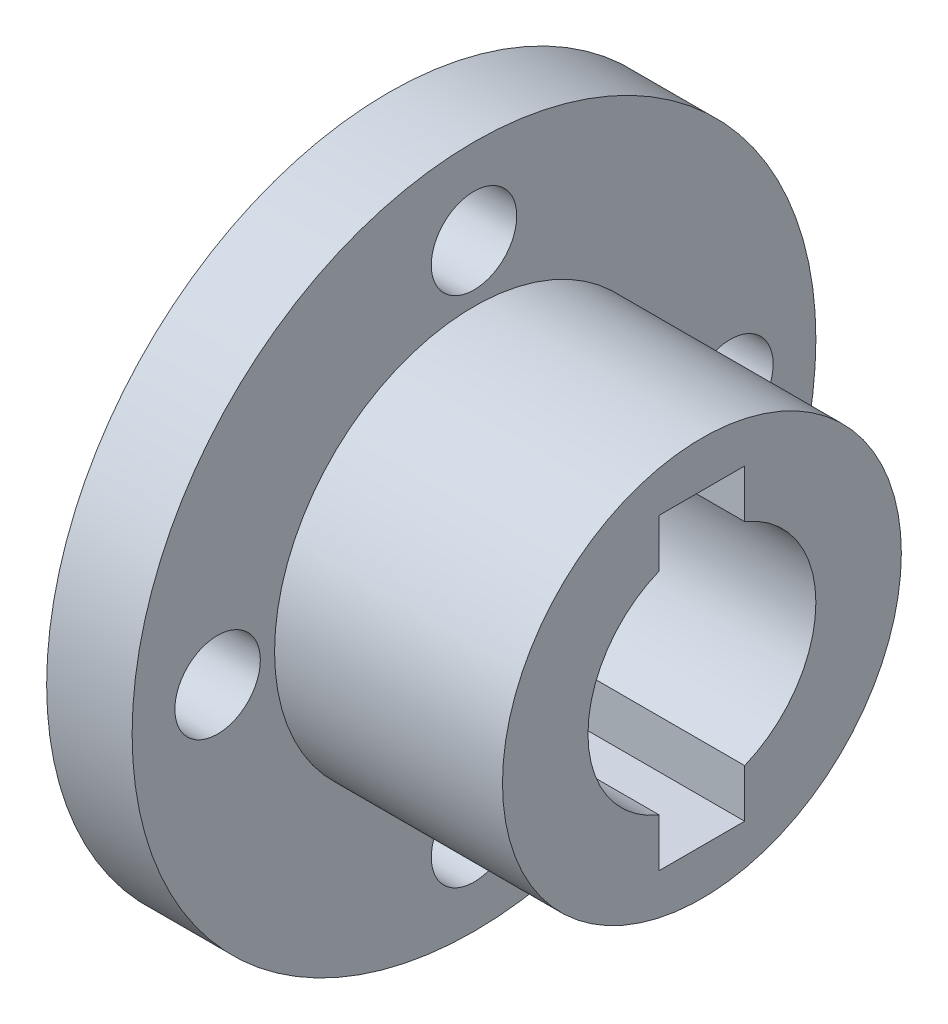
ISO-10303-21;
HEADER;
FILE_DESCRIPTION(('STEP AP214'),'2;1');
FILE_NAME('part.step','',(''),(''),'','','');
FILE_SCHEMA(('AUTOMOTIVE_DESIGN { 1 0 10303 214 1 1 1 1 }'));
ENDSEC;
DATA;
#1=APPLICATION_CONTEXT('core data for automotive mechanical design processes');
#2=APPLICATION_PROTOCOL_DEFINITION('international standard','automotive_design',2000,#1);
#3=PRODUCT_CONTEXT('',#1,'mechanical');
#4=PRODUCT('Part','Part','',(#3));
#5=PRODUCT_RELATED_PRODUCT_CATEGORY('part','',(#4));
#6=PRODUCT_DEFINITION_FORMATION('','',#4);
#7=PRODUCT_DEFINITION_CONTEXT('part definition',#1,'design');
#8=PRODUCT_DEFINITION('design','',#6,#7);
#9=PRODUCT_DEFINITION_SHAPE('','',#8);
#10=(LENGTH_UNIT() NAMED_UNIT(*) SI_UNIT(.MILLI.,.METRE.));
#11=(NAMED_UNIT(*) PLANE_ANGLE_UNIT() SI_UNIT($,.RADIAN.));
#12=(NAMED_UNIT(*) SI_UNIT($,.STERADIAN.) SOLID_ANGLE_UNIT());
#13=UNCERTAINTY_MEASURE_WITH_UNIT(LENGTH_MEASURE(1.E-05),#10,'distance_accuracy_value','');
#14=(GEOMETRIC_REPRESENTATION_CONTEXT(3) GLOBAL_UNCERTAINTY_ASSIGNED_CONTEXT((#13)) GLOBAL_UNIT_ASSIGNED_CONTEXT((#10,
#11,#12)) REPRESENTATION_CONTEXT('',''));
#15=CARTESIAN_POINT('',(0.,0.,0.));
#16=DIRECTION('',(0.,0.,1.));
#17=DIRECTION('',(1.,0.,0.));
#18=AXIS2_PLACEMENT_3D('',#15,#16,#17);
#19=CARTESIAN_POINT('',(0.,0.,0.));
#20=DIRECTION('',(-1.,0.,0.));
#21=DIRECTION('',(0.,0.,1.));
#22=AXIS2_PLACEMENT_3D('',#19,#20,#21);
#23=PLANE('',#22);
#24=CARTESIAN_POINT('',(0.,0.,0.));
#25=DIRECTION('',(1.,0.,0.));
#26=DIRECTION('',(0.,0.,-1.));
#27=AXIS2_PLACEMENT_3D('',#24,#25,#26);
#28=CIRCLE('',#27,4.);
#29=CARTESIAN_POINT('',(0.,-3.70809924354783,-1.5));
#30=VERTEX_POINT('',#29);
#31=CARTESIAN_POINT('',(0.,3.70809924354783,-1.5));
#32=VERTEX_POINT('',#31);
#33=EDGE_CURVE('E52',#30,#32,#28,.T.);
#34=ORIENTED_EDGE('',*,*,#33,.T.);
#35=DIRECTION('',(0.,1.,0.));
#36=VECTOR('',#35,1.);
#37=CARTESIAN_POINT('',(0.,5.4,-1.5));
#38=LINE('',#37,#36);
#39=CARTESIAN_POINT('',(0.,5.4,-1.5));
#40=VERTEX_POINT('',#39);
#41=EDGE_CURVE('E102',#32,#40,#38,.T.);
#42=ORIENTED_EDGE('',*,*,#41,.T.);
#43=DIRECTION('',(0.,0.,1.));
#44=VECTOR('',#43,1.);
#45=CARTESIAN_POINT('',(0.,5.4,1.5));
#46=LINE('',#45,#44);
#47=CARTESIAN_POINT('',(0.,5.4,1.5));
#48=VERTEX_POINT('',#47);
#49=EDGE_CURVE('E112',#40,#48,#46,.T.);
#50=ORIENTED_EDGE('',*,*,#49,.T.);
#51=DIRECTION('',(0.,-1.,0.));
#52=VECTOR('',#51,1.);
#53=CARTESIAN_POINT('',(0.,5.4,1.5));
#54=LINE('',#53,#52);
#55=CARTESIAN_POINT('',(0.,3.70809924354783,1.5));
#56=VERTEX_POINT('',#55);
#57=EDGE_CURVE('E121',#48,#56,#54,.T.);
#58=ORIENTED_EDGE('',*,*,#57,.T.);
#59=CARTESIAN_POINT('',(0.,-3.70809924354783,1.5));
#60=VERTEX_POINT('',#59);
#61=EDGE_CURVE('E363',#56,#60,#28,.T.);
#62=ORIENTED_EDGE('',*,*,#61,.T.);
#63=DIRECTION('',(0.,-1.,0.));
#64=VECTOR('',#63,1.);
#65=CARTESIAN_POINT('',(0.,-5.4,1.5));
#66=LINE('',#65,#64);
#67=CARTESIAN_POINT('',(0.,-5.4,1.5));
#68=VERTEX_POINT('',#67);
#69=EDGE_CURVE('E376',#60,#68,#66,.T.);
#70=ORIENTED_EDGE('',*,*,#69,.T.);
#71=DIRECTION('',(0.,0.,-1.));
#72=VECTOR('',#71,1.);
#73=CARTESIAN_POINT('',(0.,-5.4,1.5));
#74=LINE('',#73,#72);
#75=CARTESIAN_POINT('',(0.,-5.4,-1.5));
#76=VERTEX_POINT('',#75);
#77=EDGE_CURVE('E353',#68,#76,#74,.T.);
#78=ORIENTED_EDGE('',*,*,#77,.T.);
#79=DIRECTION('',(0.,1.,0.));
#80=VECTOR('',#79,1.);
#81=CARTESIAN_POINT('',(0.,-5.4,-1.5));
#82=LINE('',#81,#80);
#83=EDGE_CURVE('E384',#76,#30,#82,.T.);
#84=ORIENTED_EDGE('',*,*,#83,.T.);
#85=EDGE_LOOP('',(#34,#42,#50,#58,#62,#70,#78,#84));
#86=FACE_BOUND('',#85,.T.);
#87=CARTESIAN_POINT('',(0.,9.,0.));
#88=DIRECTION('',(-1.,0.,0.));
#89=DIRECTION('',(0.,0.,1.));
#90=AXIS2_PLACEMENT_3D('',#87,#88,#89);
#91=CIRCLE('',#90,1.5);
#92=CARTESIAN_POINT('',(0.,9.,1.5));
#93=VERTEX_POINT('',#92);
#94=EDGE_CURVE('E406',#93,#93,#91,.F.);
#95=ORIENTED_EDGE('',*,*,#94,.T.);
#96=EDGE_LOOP('',(#95));
#97=FACE_BOUND('',#96,.T.);
#98=CARTESIAN_POINT('',(0.,0.,-9.));
#99=DIRECTION('',(-1.,0.,0.));
#100=DIRECTION('',(0.,0.,1.));
#101=AXIS2_PLACEMENT_3D('',#98,#99,#100);
#102=CIRCLE('',#101,1.5);
#103=CARTESIAN_POINT('',(0.,0.,-7.5));
#104=VERTEX_POINT('',#103);
#105=EDGE_CURVE('E403',#104,#104,#102,.F.);
#106=ORIENTED_EDGE('',*,*,#105,.T.);
#107=EDGE_LOOP('',(#106));
#108=FACE_BOUND('',#107,.T.);
#109=CARTESIAN_POINT('',(0.,-9.,0.));
#110=DIRECTION('',(-1.,0.,0.));
#111=DIRECTION('',(0.,0.,1.));
#112=AXIS2_PLACEMENT_3D('',#109,#110,#111);
#113=CIRCLE('',#112,1.5);
#114=CARTESIAN_POINT('',(0.,-9.,1.50000000000006));
#115=VERTEX_POINT('',#114);
#116=EDGE_CURVE('E397',#115,#115,#113,.F.);
#117=ORIENTED_EDGE('',*,*,#116,.T.);
#118=EDGE_LOOP('',(#117));
#119=FACE_BOUND('',#118,.T.);
#120=CARTESIAN_POINT('',(0.,0.,9.));
#121=DIRECTION('',(-1.,0.,0.));
#122=DIRECTION('',(0.,0.,1.));
#123=AXIS2_PLACEMENT_3D('',#120,#121,#122);
#124=CIRCLE('',#123,1.5);
#125=CARTESIAN_POINT('',(0.,0.,10.5));
#126=VERTEX_POINT('',#125);
#127=EDGE_CURVE('E391',#126,#126,#124,.F.);
#128=ORIENTED_EDGE('',*,*,#127,.T.);
#129=EDGE_LOOP('',(#128));
#130=FACE_BOUND('',#129,.T.);
#131=CARTESIAN_POINT('',(0.,0.,0.));
#132=DIRECTION('',(1.,0.,0.));
#133=DIRECTION('',(0.,0.,-1.));
#134=AXIS2_PLACEMENT_3D('',#131,#132,#133);
#135=CIRCLE('',#134,12.);
#136=CARTESIAN_POINT('',(0.,0.,-12.));
#137=VERTEX_POINT('',#136);
#138=EDGE_CURVE('E11',#137,#137,#135,.T.);
#139=ORIENTED_EDGE('',*,*,#138,.F.);
#140=EDGE_LOOP('',(#139));
#141=FACE_BOUND('',#140,.T.);
#142=ADVANCED_FACE('F38',(#86,#97,#108,#119,#130,#141),#23,.T.);
#143=CARTESIAN_POINT('',(3.,0.,0.));
#144=DIRECTION('',(1.,0.,0.));
#145=DIRECTION('',(0.,0.,-1.));
#146=AXIS2_PLACEMENT_3D('',#143,#144,#145);
#147=CYLINDRICAL_SURFACE('',#146,4.);
#148=DIRECTION('',(1.,0.,0.));
#149=VECTOR('',#148,1.);
#150=CARTESIAN_POINT('',(0.,-3.70809924354783,1.5));
#151=LINE('',#150,#149);
#152=CARTESIAN_POINT('',(11.,-3.70809924354783,1.5));
#153=VERTEX_POINT('',#152);
#154=EDGE_CURVE('E358',#60,#153,#151,.T.);
#155=ORIENTED_EDGE('',*,*,#154,.F.);
#156=ORIENTED_EDGE('',*,*,#61,.F.);
#157=DIRECTION('',(1.,0.,0.));
#158=VECTOR('',#157,1.);
#159=CARTESIAN_POINT('',(0.,3.70809924354783,1.5));
#160=LINE('',#159,#158);
#161=CARTESIAN_POINT('',(11.,3.70809924354783,1.5));
#162=VERTEX_POINT('',#161);
#163=EDGE_CURVE('E117',#56,#162,#160,.T.);
#164=ORIENTED_EDGE('',*,*,#163,.T.);
#165=CARTESIAN_POINT('',(11.,0.,0.));
#166=DIRECTION('',(1.,0.,0.));
#167=DIRECTION('',(0.,0.,-1.));
#168=AXIS2_PLACEMENT_3D('',#165,#166,#167);
#169=CIRCLE('',#168,4.);
#170=EDGE_CURVE('E130',#162,#153,#169,.T.);
#171=ORIENTED_EDGE('',*,*,#170,.T.);
#172=EDGE_LOOP('',(#155,#156,#164,#171));
#173=FACE_BOUND('',#172,.T.);
#174=ADVANCED_FACE('F144',(#173),#147,.F.);
#175=CARTESIAN_POINT('',(3.,0.,0.));
#176=DIRECTION('',(1.,0.,0.));
#177=DIRECTION('',(0.,0.,-1.));
#178=AXIS2_PLACEMENT_3D('',#175,#176,#177);
#179=CYLINDRICAL_SURFACE('',#178,12.);
#180=ORIENTED_EDGE('',*,*,#138,.T.);
#181=EDGE_LOOP('',(#180));
#182=FACE_BOUND('',#181,.T.);
#183=CARTESIAN_POINT('',(3.,0.,0.));
#184=DIRECTION('',(1.,0.,0.));
#185=DIRECTION('',(0.,0.,-1.));
#186=AXIS2_PLACEMENT_3D('',#183,#184,#185);
#187=CIRCLE('',#186,12.);
#188=CARTESIAN_POINT('',(3.,0.,-12.));
#189=VERTEX_POINT('',#188);
#190=EDGE_CURVE('E45',#189,#189,#187,.T.);
#191=ORIENTED_EDGE('',*,*,#190,.F.);
#192=EDGE_LOOP('',(#191));
#193=FACE_BOUND('',#192,.T.);
#194=ADVANCED_FACE('F142',(#182,#193),#179,.T.);
#195=CARTESIAN_POINT('',(3.,0.,-12.));
#196=DIRECTION('',(1.,0.,0.));
#197=DIRECTION('',(0.,0.,-1.));
#198=AXIS2_PLACEMENT_3D('',#195,#196,#197);
#199=PLANE('',#198);
#200=CARTESIAN_POINT('',(3.,9.,0.));
#201=DIRECTION('',(1.,0.,0.));
#202=DIRECTION('',(0.,0.,-1.));
#203=AXIS2_PLACEMENT_3D('',#200,#201,#202);
#204=CIRCLE('',#203,1.5);
#205=CARTESIAN_POINT('',(3.,9.,-1.5));
#206=VERTEX_POINT('',#205);
#207=EDGE_CURVE('E370',#206,#206,#204,.T.);
#208=ORIENTED_EDGE('',*,*,#207,.F.);
#209=EDGE_LOOP('',(#208));
#210=FACE_BOUND('',#209,.T.);
#211=CARTESIAN_POINT('',(3.,0.,-9.));
#212=DIRECTION('',(1.,0.,0.));
#213=DIRECTION('',(0.,0.,-1.));
#214=AXIS2_PLACEMENT_3D('',#211,#212,#213);
#215=CIRCLE('',#214,1.5);
#216=CARTESIAN_POINT('',(3.,0.,-10.5));
#217=VERTEX_POINT('',#216);
#218=EDGE_CURVE('E400',#217,#217,#215,.T.);
#219=ORIENTED_EDGE('',*,*,#218,.F.);
#220=EDGE_LOOP('',(#219));
#221=FACE_BOUND('',#220,.T.);
#222=CARTESIAN_POINT('',(3.,-9.,0.));
#223=DIRECTION('',(1.,0.,0.));
#224=DIRECTION('',(0.,0.,-1.));
#225=AXIS2_PLACEMENT_3D('',#222,#223,#224);
#226=CIRCLE('',#225,1.5);
#227=CARTESIAN_POINT('',(3.,-9.,-1.49999999999994));
#228=VERTEX_POINT('',#227);
#229=EDGE_CURVE('E394',#228,#228,#226,.T.);
#230=ORIENTED_EDGE('',*,*,#229,.F.);
#231=EDGE_LOOP('',(#230));
#232=FACE_BOUND('',#231,.T.);
#233=CARTESIAN_POINT('',(3.,0.,9.));
#234=DIRECTION('',(1.,0.,0.));
#235=DIRECTION('',(0.,0.,-1.));
#236=AXIS2_PLACEMENT_3D('',#233,#234,#235);
#237=CIRCLE('',#236,1.5);
#238=CARTESIAN_POINT('',(3.,0.,7.5));
#239=VERTEX_POINT('',#238);
#240=EDGE_CURVE('E388',#239,#239,#237,.T.);
#241=ORIENTED_EDGE('',*,*,#240,.F.);
#242=EDGE_LOOP('',(#241));
#243=FACE_BOUND('',#242,.T.);
#244=ORIENTED_EDGE('',*,*,#190,.T.);
#245=EDGE_LOOP('',(#244));
#246=FACE_BOUND('',#245,.T.);
#247=CARTESIAN_POINT('',(3.,0.,0.));
#248=DIRECTION('',(1.,0.,0.));
#249=DIRECTION('',(0.,0.,-1.));
#250=AXIS2_PLACEMENT_3D('',#247,#248,#249);
#251=CIRCLE('',#250,7.);
#252=CARTESIAN_POINT('',(3.,0.,-7.));
#253=VERTEX_POINT('',#252);
#254=EDGE_CURVE('E134',#253,#253,#251,.T.);
#255=ORIENTED_EDGE('',*,*,#254,.F.);
#256=EDGE_LOOP('',(#255));
#257=FACE_BOUND('',#256,.T.);
#258=ADVANCED_FACE('F139',(#210,#221,#232,#243,#246,#257),#199,.T.);
#259=CARTESIAN_POINT('',(3.,0.,0.));
#260=DIRECTION('',(1.,0.,0.));
#261=DIRECTION('',(0.,0.,-1.));
#262=AXIS2_PLACEMENT_3D('',#259,#260,#261);
#263=CYLINDRICAL_SURFACE('',#262,7.);
#264=ORIENTED_EDGE('',*,*,#254,.T.);
#265=EDGE_LOOP('',(#264));
#266=FACE_BOUND('',#265,.T.);
#267=CARTESIAN_POINT('',(11.,0.,0.));
#268=DIRECTION('',(1.,0.,0.));
#269=DIRECTION('',(0.,0.,-1.));
#270=AXIS2_PLACEMENT_3D('',#267,#268,#269);
#271=CIRCLE('',#270,7.);
#272=CARTESIAN_POINT('',(11.,0.,-7.));
#273=VERTEX_POINT('',#272);
#274=EDGE_CURVE('E131',#273,#273,#271,.T.);
#275=ORIENTED_EDGE('',*,*,#274,.F.);
#276=EDGE_LOOP('',(#275));
#277=FACE_BOUND('',#276,.T.);
#278=ADVANCED_FACE('F150',(#266,#277),#263,.T.);
#279=CARTESIAN_POINT('',(11.,0.,-7.));
#280=DIRECTION('',(1.,0.,0.));
#281=DIRECTION('',(0.,0.,-1.));
#282=AXIS2_PLACEMENT_3D('',#279,#280,#281);
#283=PLANE('',#282);
#284=DIRECTION('',(0.,-1.,0.));
#285=VECTOR('',#284,1.);
#286=CARTESIAN_POINT('',(11.,-5.4,1.5));
#287=LINE('',#286,#285);
#288=CARTESIAN_POINT('',(11.,-5.4,1.5));
#289=VERTEX_POINT('',#288);
#290=EDGE_CURVE('E347',#153,#289,#287,.T.);
#291=ORIENTED_EDGE('',*,*,#290,.F.);
#292=ORIENTED_EDGE('',*,*,#170,.F.);
#293=DIRECTION('',(0.,-1.,0.));
#294=VECTOR('',#293,1.);
#295=CARTESIAN_POINT('',(11.,5.4,1.5));
#296=LINE('',#295,#294);
#297=CARTESIAN_POINT('',(11.,5.4,1.5));
#298=VERTEX_POINT('',#297);
#299=EDGE_CURVE('E365',#298,#162,#296,.T.);
#300=ORIENTED_EDGE('',*,*,#299,.F.);
#301=DIRECTION('',(0.,0.,1.));
#302=VECTOR('',#301,1.);
#303=CARTESIAN_POINT('',(11.,5.4,1.5));
#304=LINE('',#303,#302);
#305=CARTESIAN_POINT('',(11.,5.4,-1.5));
#306=VERTEX_POINT('',#305);
#307=EDGE_CURVE('E123',#306,#298,#304,.T.);
#308=ORIENTED_EDGE('',*,*,#307,.F.);
#309=DIRECTION('',(0.,1.,0.));
#310=VECTOR('',#309,1.);
#311=CARTESIAN_POINT('',(11.,5.4,-1.5));
#312=LINE('',#311,#310);
#313=CARTESIAN_POINT('',(11.,3.70809924354783,-1.5));
#314=VERTEX_POINT('',#313);
#315=EDGE_CURVE('E104',#314,#306,#312,.T.);
#316=ORIENTED_EDGE('',*,*,#315,.F.);
#317=CARTESIAN_POINT('',(11.,-3.70809924354783,-1.5));
#318=VERTEX_POINT('',#317);
#319=EDGE_CURVE('E127',#318,#314,#169,.T.);
#320=ORIENTED_EDGE('',*,*,#319,.F.);
#321=DIRECTION('',(0.,1.,0.));
#322=VECTOR('',#321,1.);
#323=CARTESIAN_POINT('',(11.,-5.4,-1.5));
#324=LINE('',#323,#322);
#325=CARTESIAN_POINT('',(11.,-5.4,-1.5));
#326=VERTEX_POINT('',#325);
#327=EDGE_CURVE('E354',#326,#318,#324,.T.);
#328=ORIENTED_EDGE('',*,*,#327,.F.);
#329=DIRECTION('',(0.,0.,-1.));
#330=VECTOR('',#329,1.);
#331=CARTESIAN_POINT('',(11.,-5.4,1.5));
#332=LINE('',#331,#330);
#333=EDGE_CURVE('E352',#289,#326,#332,.T.);
#334=ORIENTED_EDGE('',*,*,#333,.F.);
#335=EDGE_LOOP('',(#291,#292,#300,#308,#316,#320,#328,#334));
#336=FACE_BOUND('',#335,.T.);
#337=ORIENTED_EDGE('',*,*,#274,.T.);
#338=EDGE_LOOP('',(#337));
#339=FACE_BOUND('',#338,.T.);
#340=ADVANCED_FACE('F176',(#336,#339),#283,.T.);
#341=DIRECTION('',(1.,0.,0.));
#342=VECTOR('',#341,1.);
#343=CARTESIAN_POINT('',(0.,-3.70809924354783,-1.5));
#344=LINE('',#343,#342);
#345=EDGE_CURVE('E375',#30,#318,#344,.T.);
#346=ORIENTED_EDGE('',*,*,#345,.T.);
#347=ORIENTED_EDGE('',*,*,#319,.T.);
#348=DIRECTION('',(1.,0.,0.));
#349=VECTOR('',#348,1.);
#350=CARTESIAN_POINT('',(0.,3.70809924354783,-1.5));
#351=LINE('',#350,#349);
#352=EDGE_CURVE('E108',#32,#314,#351,.T.);
#353=ORIENTED_EDGE('',*,*,#352,.F.);
#354=ORIENTED_EDGE('',*,*,#33,.F.);
#355=EDGE_LOOP('',(#346,#347,#353,#354));
#356=FACE_BOUND('',#355,.T.);
#357=ADVANCED_FACE('F155',(#356),#147,.F.);
#358=CARTESIAN_POINT('',(0.,5.4,1.5));
#359=DIRECTION('',(0.,0.,1.));
#360=DIRECTION('',(1.,0.,0.));
#361=AXIS2_PLACEMENT_3D('',#358,#359,#360);
#362=PLANE('',#361);
#363=ORIENTED_EDGE('',*,*,#299,.T.);
#364=ORIENTED_EDGE('',*,*,#163,.F.);
#365=ORIENTED_EDGE('',*,*,#57,.F.);
#366=DIRECTION('',(1.,0.,0.));
#367=VECTOR('',#366,1.);
#368=CARTESIAN_POINT('',(0.,5.4,1.5));
#369=LINE('',#368,#367);
#370=EDGE_CURVE('E109',#48,#298,#369,.T.);
#371=ORIENTED_EDGE('',*,*,#370,.T.);
#372=EDGE_LOOP('',(#363,#364,#365,#371));
#373=FACE_BOUND('',#372,.T.);
#374=ADVANCED_FACE('F175',(#373),#362,.F.);
#375=CARTESIAN_POINT('',(0.,5.4,1.5));
#376=DIRECTION('',(0.,1.,0.));
#377=DIRECTION('',(0.,0.,1.));
#378=AXIS2_PLACEMENT_3D('',#375,#376,#377);
#379=PLANE('',#378);
#380=ORIENTED_EDGE('',*,*,#307,.T.);
#381=ORIENTED_EDGE('',*,*,#370,.F.);
#382=ORIENTED_EDGE('',*,*,#49,.F.);
#383=DIRECTION('',(1.,0.,0.));
#384=VECTOR('',#383,1.);
#385=CARTESIAN_POINT('',(0.,5.4,-1.5));
#386=LINE('',#385,#384);
#387=EDGE_CURVE('E97',#40,#306,#386,.T.);
#388=ORIENTED_EDGE('',*,*,#387,.T.);
#389=EDGE_LOOP('',(#380,#381,#382,#388));
#390=FACE_BOUND('',#389,.T.);
#391=ADVANCED_FACE('F113',(#390),#379,.F.);
#392=CARTESIAN_POINT('',(0.,5.4,-1.5));
#393=DIRECTION('',(0.,0.,-1.));
#394=DIRECTION('',(-1.,0.,0.));
#395=AXIS2_PLACEMENT_3D('',#392,#393,#394);
#396=PLANE('',#395);
#397=ORIENTED_EDGE('',*,*,#315,.T.);
#398=ORIENTED_EDGE('',*,*,#387,.F.);
#399=ORIENTED_EDGE('',*,*,#41,.F.);
#400=ORIENTED_EDGE('',*,*,#352,.T.);
#401=EDGE_LOOP('',(#397,#398,#399,#400));
#402=FACE_BOUND('',#401,.T.);
#403=ADVANCED_FACE('F99',(#402),#396,.F.);
#404=CARTESIAN_POINT('',(0.,-5.4,1.5));
#405=DIRECTION('',(0.,-1.,0.));
#406=DIRECTION('',(0.,0.,-1.));
#407=AXIS2_PLACEMENT_3D('',#404,#405,#406);
#408=PLANE('',#407);
#409=ORIENTED_EDGE('',*,*,#333,.T.);
#410=DIRECTION('',(1.,0.,0.));
#411=VECTOR('',#410,1.);
#412=CARTESIAN_POINT('',(0.,-5.4,-1.5));
#413=LINE('',#412,#411);
#414=EDGE_CURVE('E373',#76,#326,#413,.T.);
#415=ORIENTED_EDGE('',*,*,#414,.F.);
#416=ORIENTED_EDGE('',*,*,#77,.F.);
#417=DIRECTION('',(1.,0.,0.));
#418=VECTOR('',#417,1.);
#419=CARTESIAN_POINT('',(0.,-5.4,1.5));
#420=LINE('',#419,#418);
#421=EDGE_CURVE('E61',#68,#289,#420,.T.);
#422=ORIENTED_EDGE('',*,*,#421,.T.);
#423=EDGE_LOOP('',(#409,#415,#416,#422));
#424=FACE_BOUND('',#423,.T.);
#425=ADVANCED_FACE('F198',(#424),#408,.F.);
#426=CARTESIAN_POINT('',(0.,-5.4,1.5));
#427=DIRECTION('',(0.,0.,1.));
#428=DIRECTION('',(1.,0.,0.));
#429=AXIS2_PLACEMENT_3D('',#426,#427,#428);
#430=PLANE('',#429);
#431=ORIENTED_EDGE('',*,*,#290,.T.);
#432=ORIENTED_EDGE('',*,*,#421,.F.);
#433=ORIENTED_EDGE('',*,*,#69,.F.);
#434=ORIENTED_EDGE('',*,*,#154,.T.);
#435=EDGE_LOOP('',(#431,#432,#433,#434));
#436=FACE_BOUND('',#435,.T.);
#437=ADVANCED_FACE('F206',(#436),#430,.F.);
#438=CARTESIAN_POINT('',(0.,-5.4,-1.5));
#439=DIRECTION('',(0.,0.,-1.));
#440=DIRECTION('',(-1.,0.,0.));
#441=AXIS2_PLACEMENT_3D('',#438,#439,#440);
#442=PLANE('',#441);
#443=ORIENTED_EDGE('',*,*,#327,.T.);
#444=ORIENTED_EDGE('',*,*,#345,.F.);
#445=ORIENTED_EDGE('',*,*,#83,.F.);
#446=ORIENTED_EDGE('',*,*,#414,.T.);
#447=EDGE_LOOP('',(#443,#444,#445,#446));
#448=FACE_BOUND('',#447,.T.);
#449=ADVANCED_FACE('F211',(#448),#442,.F.);
#450=CARTESIAN_POINT('',(-0.00100000000000013,0.,9.));
#451=DIRECTION('',(1.,0.,0.));
#452=DIRECTION('',(0.,0.,-1.));
#453=AXIS2_PLACEMENT_3D('',#450,#451,#452);
#454=CYLINDRICAL_SURFACE('',#453,1.5);
#455=ORIENTED_EDGE('',*,*,#127,.F.);
#456=EDGE_LOOP('',(#455));
#457=FACE_BOUND('',#456,.T.);
#458=ORIENTED_EDGE('',*,*,#240,.T.);
#459=EDGE_LOOP('',(#458));
#460=FACE_BOUND('',#459,.T.);
#461=ADVANCED_FACE('F220',(#457,#460),#454,.F.);
#462=CARTESIAN_POINT('',(-0.00100000000000013,-9.,0.));
#463=DIRECTION('',(1.,0.,0.));
#464=DIRECTION('',(0.,0.,-1.));
#465=AXIS2_PLACEMENT_3D('',#462,#463,#464);
#466=CYLINDRICAL_SURFACE('',#465,1.5);
#467=ORIENTED_EDGE('',*,*,#116,.F.);
#468=EDGE_LOOP('',(#467));
#469=FACE_BOUND('',#468,.T.);
#470=ORIENTED_EDGE('',*,*,#229,.T.);
#471=EDGE_LOOP('',(#470));
#472=FACE_BOUND('',#471,.T.);
#473=ADVANCED_FACE('F232',(#469,#472),#466,.F.);
#474=CARTESIAN_POINT('',(-0.00100000000000013,0.,-9.));
#475=DIRECTION('',(1.,0.,0.));
#476=DIRECTION('',(0.,0.,-1.));
#477=AXIS2_PLACEMENT_3D('',#474,#475,#476);
#478=CYLINDRICAL_SURFACE('',#477,1.5);
#479=ORIENTED_EDGE('',*,*,#105,.F.);
#480=EDGE_LOOP('',(#479));
#481=FACE_BOUND('',#480,.T.);
#482=ORIENTED_EDGE('',*,*,#218,.T.);
#483=EDGE_LOOP('',(#482));
#484=FACE_BOUND('',#483,.T.);
#485=ADVANCED_FACE('F240',(#481,#484),#478,.F.);
#486=CARTESIAN_POINT('',(-0.00100000000000013,9.,0.));
#487=DIRECTION('',(1.,0.,0.));
#488=DIRECTION('',(0.,0.,-1.));
#489=AXIS2_PLACEMENT_3D('',#486,#487,#488);
#490=CYLINDRICAL_SURFACE('',#489,1.5);
#491=ORIENTED_EDGE('',*,*,#94,.F.);
#492=EDGE_LOOP('',(#491));
#493=FACE_BOUND('',#492,.T.);
#494=ORIENTED_EDGE('',*,*,#207,.T.);
#495=EDGE_LOOP('',(#494));
#496=FACE_BOUND('',#495,.T.);
#497=ADVANCED_FACE('F248',(#493,#496),#490,.F.);
#498=CLOSED_SHELL('',(#142,#174,#194,#258,#278,#340,#357,#374,#391,#403,#425,#437,#449,#461,
#473,#485,#497));
#499=MANIFOLD_SOLID_BREP('B2',#498);
#500=ADVANCED_BREP_SHAPE_REPRESENTATION('',(#18,#499),#14);
#501=SHAPE_DEFINITION_REPRESENTATION(#9,#500);
ENDSEC;
END-ISO-10303-21;
